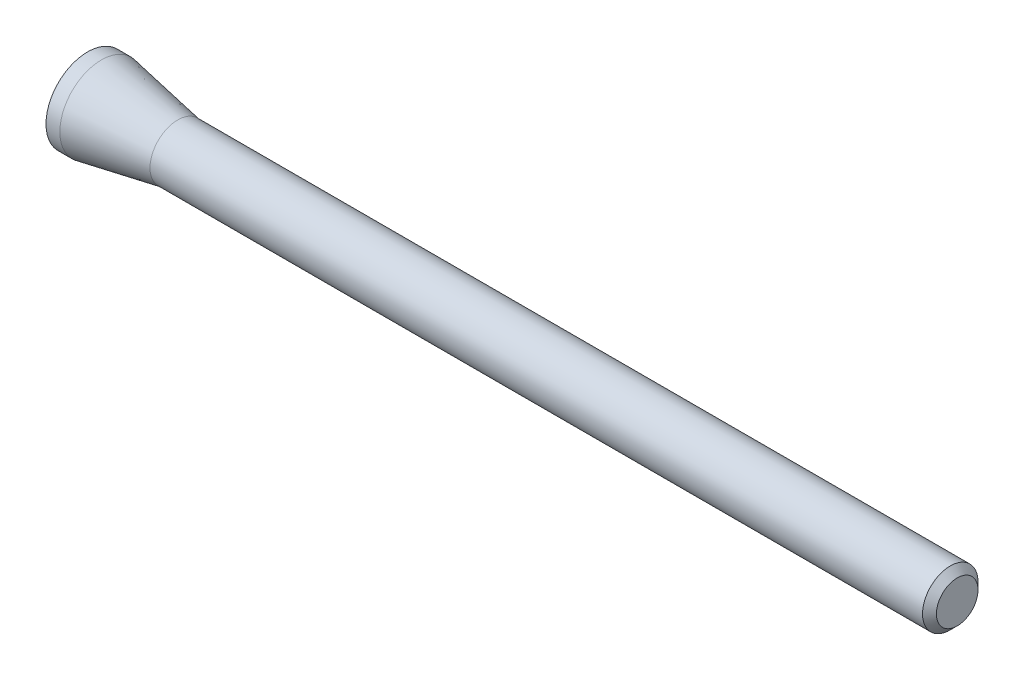
ISO-10303-21;
HEADER;
FILE_DESCRIPTION(('STEP AP214'),'2;1');
FILE_NAME('part.step','',(''),(''),'','','');
FILE_SCHEMA(('AUTOMOTIVE_DESIGN { 1 0 10303 214 1 1 1 1 }'));
ENDSEC;
DATA;
#1=APPLICATION_CONTEXT('core data for automotive mechanical design processes');
#2=APPLICATION_PROTOCOL_DEFINITION('international standard','automotive_design',2000,#1);
#3=PRODUCT_CONTEXT('',#1,'mechanical');
#4=PRODUCT('Part','Part','',(#3));
#5=PRODUCT_RELATED_PRODUCT_CATEGORY('part','',(#4));
#6=PRODUCT_DEFINITION_FORMATION('','',#4);
#7=PRODUCT_DEFINITION_CONTEXT('part definition',#1,'design');
#8=PRODUCT_DEFINITION('design','',#6,#7);
#9=PRODUCT_DEFINITION_SHAPE('','',#8);
#10=(LENGTH_UNIT() NAMED_UNIT(*) SI_UNIT(.MILLI.,.METRE.));
#11=(NAMED_UNIT(*) PLANE_ANGLE_UNIT() SI_UNIT($,.RADIAN.));
#12=(NAMED_UNIT(*) SI_UNIT($,.STERADIAN.) SOLID_ANGLE_UNIT());
#13=UNCERTAINTY_MEASURE_WITH_UNIT(LENGTH_MEASURE(1.E-05),#10,'distance_accuracy_value','');
#14=(GEOMETRIC_REPRESENTATION_CONTEXT(3) GLOBAL_UNCERTAINTY_ASSIGNED_CONTEXT((#13)) GLOBAL_UNIT_ASSIGNED_CONTEXT((#10,
#11,#12)) REPRESENTATION_CONTEXT('',''));
#15=CARTESIAN_POINT('',(0.,0.,0.));
#16=DIRECTION('',(0.,0.,1.));
#17=DIRECTION('',(1.,0.,0.));
#18=AXIS2_PLACEMENT_3D('',#15,#16,#17);
#19=CARTESIAN_POINT('',(0.,0.,0.));
#20=DIRECTION('',(1.,0.,0.));
#21=DIRECTION('',(0.,0.,-1.));
#22=AXIS2_PLACEMENT_3D('',#19,#20,#21);
#23=PLANE('',#22);
#24=CARTESIAN_POINT('',(0.,0.,0.));
#25=DIRECTION('',(-1.,0.,0.));
#26=DIRECTION('',(0.,0.,1.));
#27=AXIS2_PLACEMENT_3D('',#24,#25,#26);
#28=CIRCLE('',#27,3.);
#29=CARTESIAN_POINT('',(0.,0.,3.));
#30=VERTEX_POINT('',#29);
#31=EDGE_CURVE('E42',#30,#30,#28,.T.);
#32=ORIENTED_EDGE('',*,*,#31,.T.);
#33=EDGE_LOOP('',(#32));
#34=FACE_BOUND('',#33,.T.);
#35=ADVANCED_FACE('F31',(#34),#23,.F.);
#36=CARTESIAN_POINT('',(-7.5979270814543,0.,0.));
#37=DIRECTION('',(-1.,0.,0.));
#38=DIRECTION('',(0.,0.,1.));
#39=AXIS2_PLACEMENT_3D('',#36,#37,#38);
#40=CYLINDRICAL_SURFACE('',#39,3.);
#41=ORIENTED_EDGE('',*,*,#31,.F.);
#42=EDGE_LOOP('',(#41));
#43=FACE_BOUND('',#42,.T.);
#44=CARTESIAN_POINT('',(1.,0.,0.));
#45=DIRECTION('',(-1.,0.,0.));
#46=DIRECTION('',(0.,0.,1.));
#47=AXIS2_PLACEMENT_3D('',#44,#45,#46);
#48=CIRCLE('',#47,3.);
#49=CARTESIAN_POINT('',(1.,0.,3.));
#50=VERTEX_POINT('',#49);
#51=EDGE_CURVE('E46',#50,#50,#48,.T.);
#52=ORIENTED_EDGE('',*,*,#51,.T.);
#53=EDGE_LOOP('',(#52));
#54=FACE_BOUND('',#53,.T.);
#55=ADVANCED_FACE('F67',(#43,#54),#40,.T.);
#56=CARTESIAN_POINT('',(6.5,0.,0.));
#57=DIRECTION('',(-1.,0.,0.));
#58=DIRECTION('',(0.,0.,1.));
#59=AXIS2_PLACEMENT_3D('',#56,#57,#58);
#60=CONICAL_SURFACE('',#59,2.,0.179853499792478);
#61=ORIENTED_EDGE('',*,*,#51,.F.);
#62=EDGE_LOOP('',(#61));
#63=FACE_BOUND('',#62,.T.);
#64=CARTESIAN_POINT('',(6.5,0.,0.));
#65=DIRECTION('',(-1.,0.,0.));
#66=DIRECTION('',(0.,0.,1.));
#67=AXIS2_PLACEMENT_3D('',#64,#65,#66);
#68=CIRCLE('',#67,2.);
#69=CARTESIAN_POINT('',(6.5,0.,2.));
#70=VERTEX_POINT('',#69);
#71=EDGE_CURVE('E51',#70,#70,#68,.T.);
#72=ORIENTED_EDGE('',*,*,#71,.T.);
#73=EDGE_LOOP('',(#72));
#74=FACE_BOUND('',#73,.T.);
#75=ADVANCED_FACE('F55',(#63,#74),#60,.T.);
#76=CARTESIAN_POINT('',(-7.5979270814543,0.,0.));
#77=DIRECTION('',(-1.,0.,0.));
#78=DIRECTION('',(0.,0.,1.));
#79=AXIS2_PLACEMENT_3D('',#76,#77,#78);
#80=CYLINDRICAL_SURFACE('',#79,2.);
#81=CARTESIAN_POINT('',(62.2,0.,0.));
#82=DIRECTION('',(-1.,0.,0.));
#83=DIRECTION('',(0.,0.,1.));
#84=AXIS2_PLACEMENT_3D('',#81,#82,#83);
#85=CIRCLE('',#84,2.);
#86=CARTESIAN_POINT('',(62.2,0.,2.));
#87=VERTEX_POINT('',#86);
#88=EDGE_CURVE('E38',#87,#87,#85,.T.);
#89=ORIENTED_EDGE('',*,*,#88,.T.);
#90=EDGE_LOOP('',(#89));
#91=FACE_BOUND('',#90,.T.);
#92=ORIENTED_EDGE('',*,*,#71,.F.);
#93=EDGE_LOOP('',(#92));
#94=FACE_BOUND('',#93,.T.);
#95=ADVANCED_FACE('F57',(#91,#94),#80,.T.);
#96=CARTESIAN_POINT('',(62.7,2.,0.));
#97=DIRECTION('',(-1.,0.,0.));
#98=DIRECTION('',(0.,0.,1.));
#99=AXIS2_PLACEMENT_3D('',#96,#97,#98);
#100=PLANE('',#99);
#101=CARTESIAN_POINT('',(62.7,0.,0.));
#102=DIRECTION('',(-1.,0.,0.));
#103=DIRECTION('',(0.,0.,1.));
#104=AXIS2_PLACEMENT_3D('',#101,#102,#103);
#105=CIRCLE('',#104,1.5);
#106=CARTESIAN_POINT('',(62.7,0.,1.5));
#107=VERTEX_POINT('',#106);
#108=EDGE_CURVE('E10',#107,#107,#105,.F.);
#109=ORIENTED_EDGE('',*,*,#108,.T.);
#110=EDGE_LOOP('',(#109));
#111=FACE_BOUND('',#110,.T.);
#112=ADVANCED_FACE('F59',(#111),#100,.F.);
#113=CARTESIAN_POINT('',(62.2,0.,0.));
#114=DIRECTION('',(-1.,0.,0.));
#115=DIRECTION('',(0.,0.,1.));
#116=AXIS2_PLACEMENT_3D('',#113,#114,#115);
#117=CONICAL_SURFACE('',#116,2.,0.78539816339744);
#118=ORIENTED_EDGE('',*,*,#108,.F.);
#119=EDGE_LOOP('',(#118));
#120=FACE_BOUND('',#119,.T.);
#121=ORIENTED_EDGE('',*,*,#88,.F.);
#122=EDGE_LOOP('',(#121));
#123=FACE_BOUND('',#122,.T.);
#124=ADVANCED_FACE('F33',(#120,#123),#117,.T.);
#125=CLOSED_SHELL('',(#35,#55,#75,#95,#112,#124));
#126=MANIFOLD_SOLID_BREP('B2',#125);
#127=ADVANCED_BREP_SHAPE_REPRESENTATION('',(#18,#126),#14);
#128=SHAPE_DEFINITION_REPRESENTATION(#9,#127);
ENDSEC;
END-ISO-10303-21;
